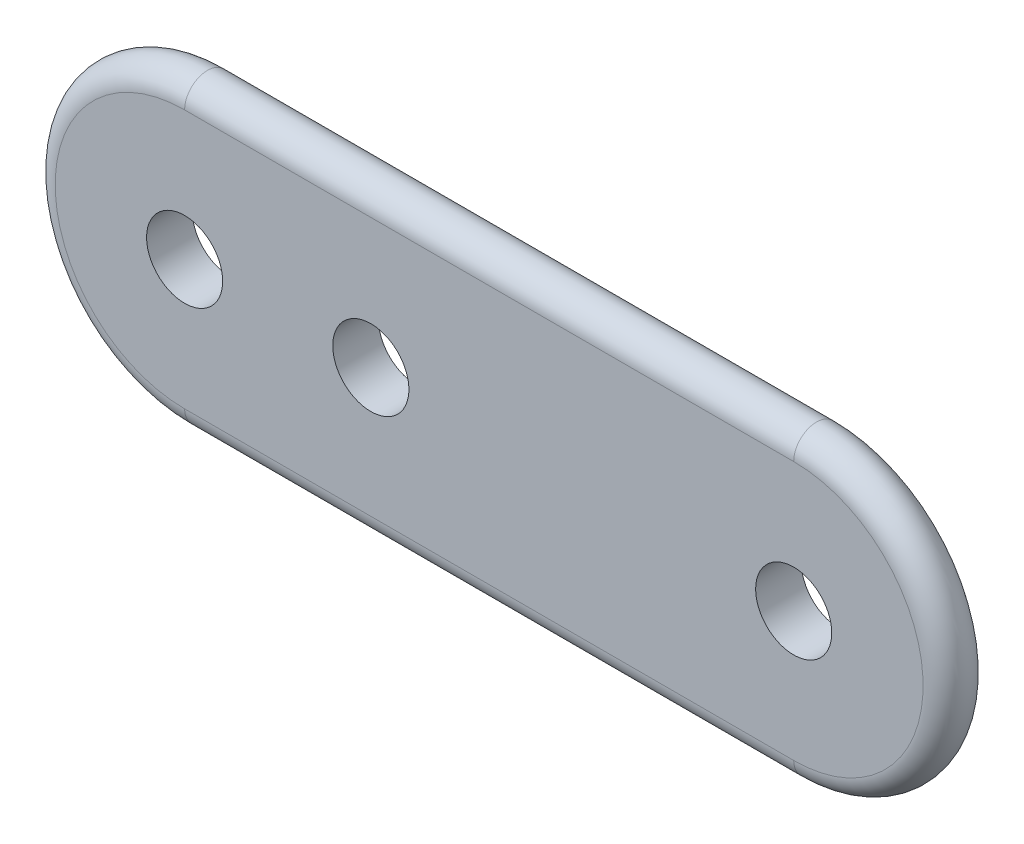
ISO-10303-21;
HEADER;
FILE_DESCRIPTION(('STEP AP214'),'2;1');
FILE_NAME('part.step','',(''),(''),'','','');
FILE_SCHEMA(('AUTOMOTIVE_DESIGN { 1 0 10303 214 1 1 1 1 }'));
ENDSEC;
DATA;
#1=APPLICATION_CONTEXT('core data for automotive mechanical design processes');
#2=APPLICATION_PROTOCOL_DEFINITION('international standard','automotive_design',2000,#1);
#3=PRODUCT_CONTEXT('',#1,'mechanical');
#4=PRODUCT('Part','Part','',(#3));
#5=PRODUCT_RELATED_PRODUCT_CATEGORY('part','',(#4));
#6=PRODUCT_DEFINITION_FORMATION('','',#4);
#7=PRODUCT_DEFINITION_CONTEXT('part definition',#1,'design');
#8=PRODUCT_DEFINITION('design','',#6,#7);
#9=PRODUCT_DEFINITION_SHAPE('','',#8);
#10=(LENGTH_UNIT() NAMED_UNIT(*) SI_UNIT(.MILLI.,.METRE.));
#11=(NAMED_UNIT(*) PLANE_ANGLE_UNIT() SI_UNIT($,.RADIAN.));
#12=(NAMED_UNIT(*) SI_UNIT($,.STERADIAN.) SOLID_ANGLE_UNIT());
#13=UNCERTAINTY_MEASURE_WITH_UNIT(LENGTH_MEASURE(1.E-05),#10,'distance_accuracy_value','');
#14=(GEOMETRIC_REPRESENTATION_CONTEXT(3) GLOBAL_UNCERTAINTY_ASSIGNED_CONTEXT((#13)) GLOBAL_UNIT_ASSIGNED_CONTEXT((#10,
#11,#12)) REPRESENTATION_CONTEXT('',''));
#15=CARTESIAN_POINT('',(0.,0.,0.));
#16=DIRECTION('',(0.,0.,1.));
#17=DIRECTION('',(1.,0.,0.));
#18=AXIS2_PLACEMENT_3D('',#15,#16,#17);
#19=CARTESIAN_POINT('',(-20.,0.0411989681822212,3.));
#20=DIRECTION('',(0.,0.,1.));
#21=DIRECTION('',(1.,0.,0.));
#22=AXIS2_PLACEMENT_3D('',#19,#20,#21);
#23=PLANE('',#22);
#24=CARTESIAN_POINT('',(-20.,0.0411989681822212,3.));
#25=DIRECTION('',(0.,0.,-1.));
#26=DIRECTION('',(-1.,0.,0.));
#27=AXIS2_PLACEMENT_3D('',#24,#25,#26);
#28=CIRCLE('',#27,2.49999999999998);
#29=CARTESIAN_POINT('',(-22.5,0.0411989681822212,3.));
#30=VERTEX_POINT('',#29);
#31=EDGE_CURVE('E176',#30,#30,#28,.T.);
#32=ORIENTED_EDGE('',*,*,#31,.T.);
#33=EDGE_LOOP('',(#32));
#34=FACE_BOUND('',#33,.T.);
#35=CARTESIAN_POINT('',(-7.77183563993397,0.,3.));
#36=DIRECTION('',(0.,0.,-1.));
#37=DIRECTION('',(-1.,0.,0.));
#38=AXIS2_PLACEMENT_3D('',#35,#36,#37);
#39=CIRCLE('',#38,2.49999999999999);
#40=CARTESIAN_POINT('',(-10.271835639934,0.,3.));
#41=VERTEX_POINT('',#40);
#42=EDGE_CURVE('E167',#41,#41,#39,.T.);
#43=ORIENTED_EDGE('',*,*,#42,.T.);
#44=EDGE_LOOP('',(#43));
#45=FACE_BOUND('',#44,.T.);
#46=CARTESIAN_POINT('',(20.,0.0411989681822212,3.));
#47=DIRECTION('',(0.,0.,-1.));
#48=DIRECTION('',(-1.,0.,0.));
#49=AXIS2_PLACEMENT_3D('',#46,#47,#48);
#50=CIRCLE('',#49,2.49999999999998);
#51=CARTESIAN_POINT('',(17.5,0.0411989681822212,3.));
#52=VERTEX_POINT('',#51);
#53=EDGE_CURVE('E111',#52,#52,#50,.T.);
#54=ORIENTED_EDGE('',*,*,#53,.T.);
#55=EDGE_LOOP('',(#54));
#56=FACE_BOUND('',#55,.T.);
#57=DIRECTION('',(1.,0.,0.));
#58=VECTOR('',#57,1.);
#59=CARTESIAN_POINT('',(20.,-8.45880103181778,3.));
#60=LINE('',#59,#58);
#61=CARTESIAN_POINT('',(-20.,-8.45880103181778,3.));
#62=VERTEX_POINT('',#61);
#63=CARTESIAN_POINT('',(20.,-8.45880103181778,3.));
#64=VERTEX_POINT('',#63);
#65=EDGE_CURVE('E53',#62,#64,#60,.T.);
#66=ORIENTED_EDGE('',*,*,#65,.T.);
#67=CARTESIAN_POINT('',(20.,0.0411989681822212,3.));
#68=DIRECTION('',(0.,0.,1.));
#69=DIRECTION('',(1.,0.,0.));
#70=AXIS2_PLACEMENT_3D('',#67,#68,#69);
#71=CIRCLE('',#70,8.5);
#72=CARTESIAN_POINT('',(20.,8.54119896818222,3.));
#73=VERTEX_POINT('',#72);
#74=EDGE_CURVE('E12',#64,#73,#71,.T.);
#75=ORIENTED_EDGE('',*,*,#74,.T.);
#76=DIRECTION('',(-1.,0.,0.));
#77=VECTOR('',#76,1.);
#78=CARTESIAN_POINT('',(-20.,8.54119896818222,3.));
#79=LINE('',#78,#77);
#80=CARTESIAN_POINT('',(-20.,8.54119896818222,3.));
#81=VERTEX_POINT('',#80);
#82=EDGE_CURVE('E119',#73,#81,#79,.T.);
#83=ORIENTED_EDGE('',*,*,#82,.T.);
#84=CARTESIAN_POINT('',(-20.,0.0411989681822212,3.));
#85=DIRECTION('',(0.,0.,1.));
#86=DIRECTION('',(1.,0.,0.));
#87=AXIS2_PLACEMENT_3D('',#84,#85,#86);
#88=CIRCLE('',#87,8.5);
#89=EDGE_CURVE('E63',#81,#62,#88,.T.);
#90=ORIENTED_EDGE('',*,*,#89,.T.);
#91=EDGE_LOOP('',(#66,#75,#83,#90));
#92=FACE_BOUND('',#91,.T.);
#93=ADVANCED_FACE('F42',(#34,#45,#56,#92),#23,.T.);
#94=CARTESIAN_POINT('',(-20.,0.0411989681822212,0.));
#95=DIRECTION('',(0.,0.,1.));
#96=DIRECTION('',(1.,0.,0.));
#97=AXIS2_PLACEMENT_3D('',#94,#95,#96);
#98=PLANE('',#97);
#99=CARTESIAN_POINT('',(-20.,0.0411989681822212,0.));
#100=DIRECTION('',(0.,0.,-1.));
#101=DIRECTION('',(-1.,0.,0.));
#102=AXIS2_PLACEMENT_3D('',#99,#100,#101);
#103=CIRCLE('',#102,2.49999999999998);
#104=CARTESIAN_POINT('',(-22.5,0.0411989681822212,0.));
#105=VERTEX_POINT('',#104);
#106=EDGE_CURVE('E179',#105,#105,#103,.T.);
#107=ORIENTED_EDGE('',*,*,#106,.F.);
#108=EDGE_LOOP('',(#107));
#109=FACE_BOUND('',#108,.T.);
#110=CARTESIAN_POINT('',(-7.77183563993397,0.,0.));
#111=DIRECTION('',(0.,0.,-1.));
#112=DIRECTION('',(-1.,0.,0.));
#113=AXIS2_PLACEMENT_3D('',#110,#111,#112);
#114=CIRCLE('',#113,2.49999999999999);
#115=CARTESIAN_POINT('',(-10.271835639934,0.,0.));
#116=VERTEX_POINT('',#115);
#117=EDGE_CURVE('E171',#116,#116,#114,.T.);
#118=ORIENTED_EDGE('',*,*,#117,.F.);
#119=EDGE_LOOP('',(#118));
#120=FACE_BOUND('',#119,.T.);
#121=CARTESIAN_POINT('',(20.,0.0411989681822212,0.));
#122=DIRECTION('',(0.,0.,-1.));
#123=DIRECTION('',(-1.,0.,0.));
#124=AXIS2_PLACEMENT_3D('',#121,#122,#123);
#125=CIRCLE('',#124,2.49999999999998);
#126=CARTESIAN_POINT('',(17.5,0.0411989681822212,0.));
#127=VERTEX_POINT('',#126);
#128=EDGE_CURVE('E163',#127,#127,#125,.T.);
#129=ORIENTED_EDGE('',*,*,#128,.F.);
#130=EDGE_LOOP('',(#129));
#131=FACE_BOUND('',#130,.T.);
#132=DIRECTION('',(-1.,0.,0.));
#133=VECTOR('',#132,1.);
#134=CARTESIAN_POINT('',(-20.,8.54119896818222,0.));
#135=LINE('',#134,#133);
#136=CARTESIAN_POINT('',(-20.,8.54119896818222,0.));
#137=VERTEX_POINT('',#136);
#138=CARTESIAN_POINT('',(20.,8.54119896818222,0.));
#139=VERTEX_POINT('',#138);
#140=EDGE_CURVE('E97',#137,#139,#135,.F.);
#141=ORIENTED_EDGE('',*,*,#140,.T.);
#142=CARTESIAN_POINT('',(20.,0.0411989681822212,0.));
#143=DIRECTION('',(0.,0.,1.));
#144=DIRECTION('',(1.,0.,0.));
#145=AXIS2_PLACEMENT_3D('',#142,#143,#144);
#146=CIRCLE('',#145,8.5);
#147=CARTESIAN_POINT('',(20.,-8.45880103181778,0.));
#148=VERTEX_POINT('',#147);
#149=EDGE_CURVE('E116',#139,#148,#146,.F.);
#150=ORIENTED_EDGE('',*,*,#149,.T.);
#151=DIRECTION('',(1.,0.,0.));
#152=VECTOR('',#151,1.);
#153=CARTESIAN_POINT('',(-20.,-8.45880103181778,0.));
#154=LINE('',#153,#152);
#155=CARTESIAN_POINT('',(-20.,-8.45880103181778,0.));
#156=VERTEX_POINT('',#155);
#157=EDGE_CURVE('E100',#148,#156,#154,.F.);
#158=ORIENTED_EDGE('',*,*,#157,.T.);
#159=CARTESIAN_POINT('',(-20.,0.0411989681822212,0.));
#160=DIRECTION('',(0.,0.,1.));
#161=DIRECTION('',(1.,0.,0.));
#162=AXIS2_PLACEMENT_3D('',#159,#160,#161);
#163=CIRCLE('',#162,8.5);
#164=EDGE_CURVE('E86',#156,#137,#163,.F.);
#165=ORIENTED_EDGE('',*,*,#164,.T.);
#166=EDGE_LOOP('',(#141,#150,#158,#165));
#167=FACE_BOUND('',#166,.T.);
#168=ADVANCED_FACE('F95',(#109,#120,#131,#167),#98,.F.);
#169=CARTESIAN_POINT('',(-20.,0.0411989681822212,1.5));
#170=DIRECTION('',(0.,0.,1.));
#171=DIRECTION('',(1.,0.,0.));
#172=AXIS2_PLACEMENT_3D('',#169,#170,#171);
#173=TOROIDAL_SURFACE('',#172,8.5,1.5);
#174=CARTESIAN_POINT('',(-20.,-8.45880103181778,1.5));
#175=DIRECTION('',(1.,0.,0.));
#176=DIRECTION('',(0.,0.,-1.));
#177=AXIS2_PLACEMENT_3D('',#174,#175,#176);
#178=CIRCLE('',#177,1.5);
#179=EDGE_CURVE('E46',#62,#156,#178,.T.);
#180=ORIENTED_EDGE('',*,*,#179,.F.);
#181=ORIENTED_EDGE('',*,*,#89,.F.);
#182=CARTESIAN_POINT('',(-20.,8.54119896818222,1.5));
#183=DIRECTION('',(1.,0.,0.));
#184=DIRECTION('',(0.,0.,-1.));
#185=AXIS2_PLACEMENT_3D('',#182,#183,#184);
#186=CIRCLE('',#185,1.5);
#187=EDGE_CURVE('E84',#137,#81,#186,.T.);
#188=ORIENTED_EDGE('',*,*,#187,.F.);
#189=ORIENTED_EDGE('',*,*,#164,.F.);
#190=EDGE_LOOP('',(#180,#181,#188,#189));
#191=FACE_BOUND('',#190,.T.);
#192=ADVANCED_FACE('F44',(#191),#173,.T.);
#193=CARTESIAN_POINT('',(-20.,-8.45880103181778,1.5));
#194=DIRECTION('',(-1.,0.,0.));
#195=DIRECTION('',(0.,0.,1.));
#196=AXIS2_PLACEMENT_3D('',#193,#194,#195);
#197=CYLINDRICAL_SURFACE('',#196,1.5);
#198=ORIENTED_EDGE('',*,*,#65,.F.);
#199=ORIENTED_EDGE('',*,*,#179,.T.);
#200=ORIENTED_EDGE('',*,*,#157,.F.);
#201=CARTESIAN_POINT('',(20.,-8.45880103181778,1.5));
#202=DIRECTION('',(1.,0.,0.));
#203=DIRECTION('',(0.,0.,-1.));
#204=AXIS2_PLACEMENT_3D('',#201,#202,#203);
#205=CIRCLE('',#204,1.5);
#206=EDGE_CURVE('E91',#64,#148,#205,.T.);
#207=ORIENTED_EDGE('',*,*,#206,.F.);
#208=EDGE_LOOP('',(#198,#199,#200,#207));
#209=FACE_BOUND('',#208,.T.);
#210=ADVANCED_FACE('F217',(#209),#197,.T.);
#211=CARTESIAN_POINT('',(-20.,8.54119896818222,1.5));
#212=DIRECTION('',(1.,0.,0.));
#213=DIRECTION('',(0.,0.,-1.));
#214=AXIS2_PLACEMENT_3D('',#211,#212,#213);
#215=CYLINDRICAL_SURFACE('',#214,1.5);
#216=ORIENTED_EDGE('',*,*,#187,.T.);
#217=ORIENTED_EDGE('',*,*,#82,.F.);
#218=CARTESIAN_POINT('',(20.,8.54119896818222,1.5));
#219=DIRECTION('',(1.,0.,0.));
#220=DIRECTION('',(0.,0.,-1.));
#221=AXIS2_PLACEMENT_3D('',#218,#219,#220);
#222=CIRCLE('',#221,1.5);
#223=EDGE_CURVE('E104',#139,#73,#222,.T.);
#224=ORIENTED_EDGE('',*,*,#223,.F.);
#225=ORIENTED_EDGE('',*,*,#140,.F.);
#226=EDGE_LOOP('',(#216,#217,#224,#225));
#227=FACE_BOUND('',#226,.T.);
#228=ADVANCED_FACE('F103',(#227),#215,.T.);
#229=CARTESIAN_POINT('',(20.,0.0411989681822212,1.5));
#230=DIRECTION('',(0.,0.,1.));
#231=DIRECTION('',(1.,0.,0.));
#232=AXIS2_PLACEMENT_3D('',#229,#230,#231);
#233=TOROIDAL_SURFACE('',#232,8.5,1.5);
#234=ORIENTED_EDGE('',*,*,#74,.F.);
#235=ORIENTED_EDGE('',*,*,#206,.T.);
#236=ORIENTED_EDGE('',*,*,#149,.F.);
#237=ORIENTED_EDGE('',*,*,#223,.T.);
#238=EDGE_LOOP('',(#234,#235,#236,#237));
#239=FACE_BOUND('',#238,.T.);
#240=ADVANCED_FACE('F202',(#239),#233,.T.);
#241=CARTESIAN_POINT('',(20.,0.0411989681822212,0.));
#242=DIRECTION('',(0.,0.,-1.));
#243=DIRECTION('',(-1.,0.,0.));
#244=AXIS2_PLACEMENT_3D('',#241,#242,#243);
#245=CYLINDRICAL_SURFACE('',#244,2.49999999999998);
#246=ORIENTED_EDGE('',*,*,#53,.F.);
#247=EDGE_LOOP('',(#246));
#248=FACE_BOUND('',#247,.T.);
#249=ORIENTED_EDGE('',*,*,#128,.T.);
#250=EDGE_LOOP('',(#249));
#251=FACE_BOUND('',#250,.T.);
#252=ADVANCED_FACE('F193',(#248,#251),#245,.F.);
#253=CARTESIAN_POINT('',(-7.77183563993397,0.,0.));
#254=DIRECTION('',(0.,0.,-1.));
#255=DIRECTION('',(-1.,0.,0.));
#256=AXIS2_PLACEMENT_3D('',#253,#254,#255);
#257=CYLINDRICAL_SURFACE('',#256,2.49999999999999);
#258=ORIENTED_EDGE('',*,*,#42,.F.);
#259=EDGE_LOOP('',(#258));
#260=FACE_BOUND('',#259,.T.);
#261=ORIENTED_EDGE('',*,*,#117,.T.);
#262=EDGE_LOOP('',(#261));
#263=FACE_BOUND('',#262,.T.);
#264=ADVANCED_FACE('F191',(#260,#263),#257,.F.);
#265=CARTESIAN_POINT('',(-20.,0.0411989681822212,0.));
#266=DIRECTION('',(0.,0.,-1.));
#267=DIRECTION('',(-1.,0.,0.));
#268=AXIS2_PLACEMENT_3D('',#265,#266,#267);
#269=CYLINDRICAL_SURFACE('',#268,2.49999999999998);
#270=ORIENTED_EDGE('',*,*,#31,.F.);
#271=EDGE_LOOP('',(#270));
#272=FACE_BOUND('',#271,.T.);
#273=ORIENTED_EDGE('',*,*,#106,.T.);
#274=EDGE_LOOP('',(#273));
#275=FACE_BOUND('',#274,.T.);
#276=ADVANCED_FACE('F183',(#272,#275),#269,.F.);
#277=CLOSED_SHELL('',(#93,#168,#192,#210,#228,#240,#252,#264,#276));
#278=MANIFOLD_SOLID_BREP('B2',#277);
#279=ADVANCED_BREP_SHAPE_REPRESENTATION('',(#18,#278),#14);
#280=SHAPE_DEFINITION_REPRESENTATION(#9,#279);
ENDSEC;
END-ISO-10303-21;
